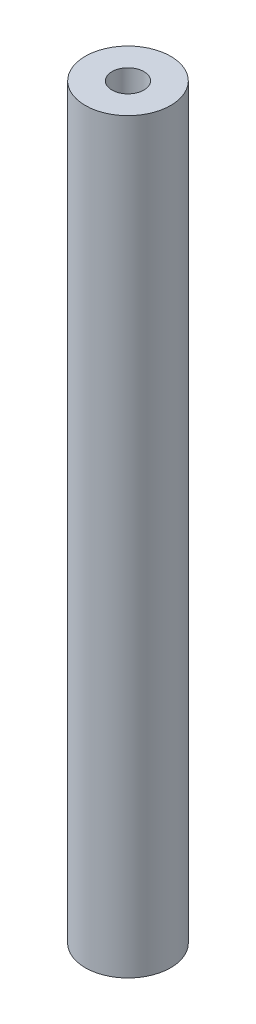
ISO-10303-21;
HEADER;
FILE_DESCRIPTION(('STEP AP214'),'2;1');
FILE_NAME('part.step','',(''),(''),'','','');
FILE_SCHEMA(('AUTOMOTIVE_DESIGN { 1 0 10303 214 1 1 1 1 }'));
ENDSEC;
DATA;
#1=APPLICATION_CONTEXT('core data for automotive mechanical design processes');
#2=APPLICATION_PROTOCOL_DEFINITION('international standard','automotive_design',2000,#1);
#3=PRODUCT_CONTEXT('',#1,'mechanical');
#4=PRODUCT('Part','Part','',(#3));
#5=PRODUCT_RELATED_PRODUCT_CATEGORY('part','',(#4));
#6=PRODUCT_DEFINITION_FORMATION('','',#4);
#7=PRODUCT_DEFINITION_CONTEXT('part definition',#1,'design');
#8=PRODUCT_DEFINITION('design','',#6,#7);
#9=PRODUCT_DEFINITION_SHAPE('','',#8);
#10=(LENGTH_UNIT() NAMED_UNIT(*) SI_UNIT(.MILLI.,.METRE.));
#11=(NAMED_UNIT(*) PLANE_ANGLE_UNIT() SI_UNIT($,.RADIAN.));
#12=(NAMED_UNIT(*) SI_UNIT($,.STERADIAN.) SOLID_ANGLE_UNIT());
#13=UNCERTAINTY_MEASURE_WITH_UNIT(LENGTH_MEASURE(1.E-05),#10,'distance_accuracy_value','');
#14=(GEOMETRIC_REPRESENTATION_CONTEXT(3) GLOBAL_UNCERTAINTY_ASSIGNED_CONTEXT((#13)) GLOBAL_UNIT_ASSIGNED_CONTEXT((#10,
#11,#12)) REPRESENTATION_CONTEXT('',''));
#15=CARTESIAN_POINT('',(0.,0.,0.));
#16=DIRECTION('',(0.,0.,1.));
#17=DIRECTION('',(1.,0.,0.));
#18=AXIS2_PLACEMENT_3D('',#15,#16,#17);
#19=CARTESIAN_POINT('',(-1.93206998513588,35.,-1.41071776692461));
#20=DIRECTION('',(0.,1.,0.));
#21=DIRECTION('',(0.,0.,1.));
#22=AXIS2_PLACEMENT_3D('',#19,#20,#21);
#23=PLANE('',#22);
#24=CARTESIAN_POINT('',(-1.93206998513588,35.,-1.41071776692461));
#25=DIRECTION('',(0.,1.,0.));
#26=DIRECTION('',(0.,0.,1.));
#27=AXIS2_PLACEMENT_3D('',#24,#25,#26);
#28=CIRCLE('',#27,2.);
#29=CARTESIAN_POINT('',(-1.93206998513588,35.,0.589282233075388));
#30=VERTEX_POINT('',#29);
#31=EDGE_CURVE('E10',#30,#30,#28,.T.);
#32=ORIENTED_EDGE('',*,*,#31,.T.);
#33=EDGE_LOOP('',(#32));
#34=FACE_BOUND('',#33,.T.);
#35=CARTESIAN_POINT('',(-1.93206998513588,35.,-1.41071776692461));
#36=DIRECTION('',(0.,1.,0.));
#37=DIRECTION('',(0.,0.,1.));
#38=AXIS2_PLACEMENT_3D('',#35,#36,#37);
#39=CIRCLE('',#38,0.75);
#40=CARTESIAN_POINT('',(-1.93206998513588,35.,-0.660717766924612));
#41=VERTEX_POINT('',#40);
#42=EDGE_CURVE('E42',#41,#41,#39,.T.);
#43=ORIENTED_EDGE('',*,*,#42,.F.);
#44=EDGE_LOOP('',(#43));
#45=FACE_BOUND('',#44,.T.);
#46=ADVANCED_FACE('F31',(#34,#45),#23,.T.);
#47=CARTESIAN_POINT('',(-1.93206998513588,0.,-1.41071776692461));
#48=DIRECTION('',(0.,1.,0.));
#49=DIRECTION('',(0.,0.,1.));
#50=AXIS2_PLACEMENT_3D('',#47,#48,#49);
#51=PLANE('',#50);
#52=CARTESIAN_POINT('',(-1.93206998513588,0.,-1.41071776692461));
#53=DIRECTION('',(0.,1.,0.));
#54=DIRECTION('',(0.,0.,1.));
#55=AXIS2_PLACEMENT_3D('',#52,#53,#54);
#56=CIRCLE('',#55,2.);
#57=CARTESIAN_POINT('',(-1.93206998513588,0.,0.589282233075388));
#58=VERTEX_POINT('',#57);
#59=EDGE_CURVE('E35',#58,#58,#56,.T.);
#60=ORIENTED_EDGE('',*,*,#59,.F.);
#61=EDGE_LOOP('',(#60));
#62=FACE_BOUND('',#61,.T.);
#63=CARTESIAN_POINT('',(-1.93206998513588,0.,-1.41071776692461));
#64=DIRECTION('',(0.,1.,0.));
#65=DIRECTION('',(0.,0.,1.));
#66=AXIS2_PLACEMENT_3D('',#63,#64,#65);
#67=CIRCLE('',#66,0.75);
#68=CARTESIAN_POINT('',(-1.93206998513588,0.,-0.660717766924612));
#69=VERTEX_POINT('',#68);
#70=EDGE_CURVE('E44',#69,#69,#67,.T.);
#71=ORIENTED_EDGE('',*,*,#70,.T.);
#72=EDGE_LOOP('',(#71));
#73=FACE_BOUND('',#72,.T.);
#74=ADVANCED_FACE('F54',(#62,#73),#51,.F.);
#75=CARTESIAN_POINT('',(-1.93206998513588,35.,-1.41071776692461));
#76=DIRECTION('',(0.,-1.,0.));
#77=DIRECTION('',(0.,0.,-1.));
#78=AXIS2_PLACEMENT_3D('',#75,#76,#77);
#79=CYLINDRICAL_SURFACE('',#78,2.);
#80=ORIENTED_EDGE('',*,*,#31,.F.);
#81=EDGE_LOOP('',(#80));
#82=FACE_BOUND('',#81,.T.);
#83=ORIENTED_EDGE('',*,*,#59,.T.);
#84=EDGE_LOOP('',(#83));
#85=FACE_BOUND('',#84,.T.);
#86=ADVANCED_FACE('F33',(#82,#85),#79,.T.);
#87=CARTESIAN_POINT('',(-1.93206998513588,35.,-1.41071776692461));
#88=DIRECTION('',(0.,-1.,0.));
#89=DIRECTION('',(0.,0.,-1.));
#90=AXIS2_PLACEMENT_3D('',#87,#88,#89);
#91=CYLINDRICAL_SURFACE('',#90,0.75);
#92=ORIENTED_EDGE('',*,*,#42,.T.);
#93=EDGE_LOOP('',(#92));
#94=FACE_BOUND('',#93,.T.);
#95=ORIENTED_EDGE('',*,*,#70,.F.);
#96=EDGE_LOOP('',(#95));
#97=FACE_BOUND('',#96,.T.);
#98=ADVANCED_FACE('F50',(#94,#97),#91,.F.);
#99=CLOSED_SHELL('',(#46,#74,#86,#98));
#100=MANIFOLD_SOLID_BREP('B2',#99);
#101=ADVANCED_BREP_SHAPE_REPRESENTATION('',(#18,#100),#14);
#102=SHAPE_DEFINITION_REPRESENTATION(#9,#101);
ENDSEC;
END-ISO-10303-21;
